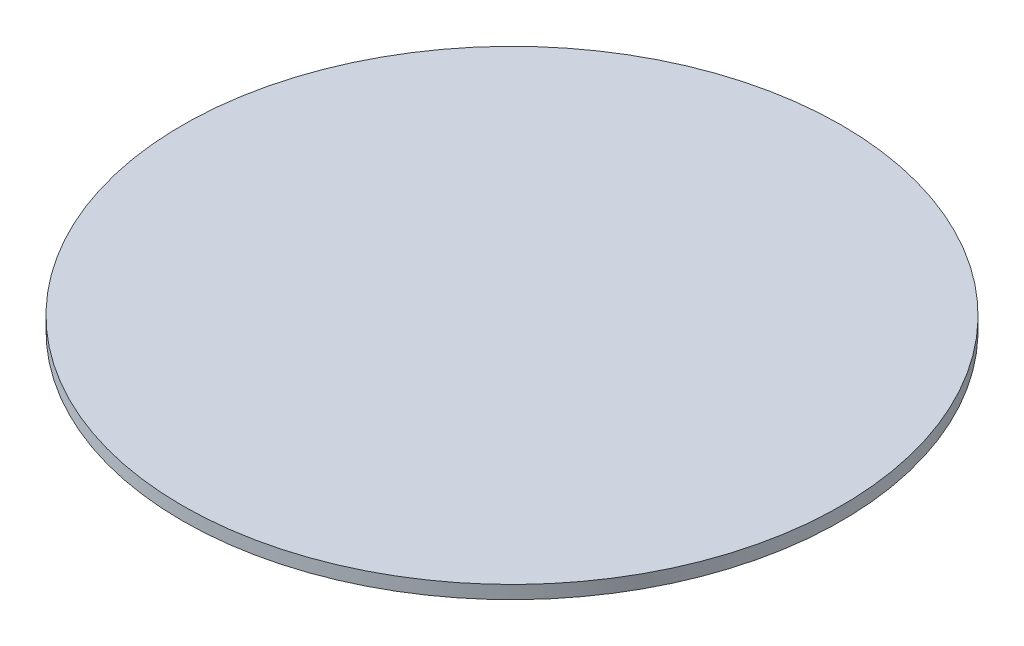
ISO-10303-21;
HEADER;
FILE_DESCRIPTION(('STEP AP214'),'2;1');
FILE_NAME('part.step','',(''),(''),'','','');
FILE_SCHEMA(('AUTOMOTIVE_DESIGN { 1 0 10303 214 1 1 1 1 }'));
ENDSEC;
DATA;
#1=APPLICATION_CONTEXT('core data for automotive mechanical design processes');
#2=APPLICATION_PROTOCOL_DEFINITION('international standard','automotive_design',2000,#1);
#3=PRODUCT_CONTEXT('',#1,'mechanical');
#4=PRODUCT('Part','Part','',(#3));
#5=PRODUCT_RELATED_PRODUCT_CATEGORY('part','',(#4));
#6=PRODUCT_DEFINITION_FORMATION('','',#4);
#7=PRODUCT_DEFINITION_CONTEXT('part definition',#1,'design');
#8=PRODUCT_DEFINITION('design','',#6,#7);
#9=PRODUCT_DEFINITION_SHAPE('','',#8);
#10=(LENGTH_UNIT() NAMED_UNIT(*) SI_UNIT(.MILLI.,.METRE.));
#11=(NAMED_UNIT(*) PLANE_ANGLE_UNIT() SI_UNIT($,.RADIAN.));
#12=(NAMED_UNIT(*) SI_UNIT($,.STERADIAN.) SOLID_ANGLE_UNIT());
#13=UNCERTAINTY_MEASURE_WITH_UNIT(LENGTH_MEASURE(1.E-05),#10,'distance_accuracy_value','');
#14=(GEOMETRIC_REPRESENTATION_CONTEXT(3) GLOBAL_UNCERTAINTY_ASSIGNED_CONTEXT((#13)) GLOBAL_UNIT_ASSIGNED_CONTEXT((#10,
#11,#12)) REPRESENTATION_CONTEXT('',''));
#15=CARTESIAN_POINT('',(0.,0.,0.));
#16=DIRECTION('',(0.,0.,1.));
#17=DIRECTION('',(1.,0.,0.));
#18=AXIS2_PLACEMENT_3D('',#15,#16,#17);
#19=CARTESIAN_POINT('',(0.,3.,0.));
#20=DIRECTION('',(0.,-1.,0.));
#21=DIRECTION('',(0.,0.,-1.));
#22=AXIS2_PLACEMENT_3D('',#19,#20,#21);
#23=CYLINDRICAL_SURFACE('',#22,75.);
#24=CARTESIAN_POINT('',(0.,3.,0.));
#25=DIRECTION('',(0.,1.,0.));
#26=DIRECTION('',(0.,0.,1.));
#27=AXIS2_PLACEMENT_3D('',#24,#25,#26);
#28=CIRCLE('',#27,75.);
#29=CARTESIAN_POINT('',(0.,3.,75.));
#30=VERTEX_POINT('',#29);
#31=EDGE_CURVE('E10',#30,#30,#28,.T.);
#32=ORIENTED_EDGE('',*,*,#31,.F.);
#33=EDGE_LOOP('',(#32));
#34=FACE_BOUND('',#33,.T.);
#35=CARTESIAN_POINT('',(0.,0.,0.));
#36=DIRECTION('',(0.,1.,0.));
#37=DIRECTION('',(0.,0.,1.));
#38=AXIS2_PLACEMENT_3D('',#35,#36,#37);
#39=CIRCLE('',#38,75.);
#40=CARTESIAN_POINT('',(0.,0.,75.));
#41=VERTEX_POINT('',#40);
#42=EDGE_CURVE('E33',#41,#41,#39,.T.);
#43=ORIENTED_EDGE('',*,*,#42,.T.);
#44=EDGE_LOOP('',(#43));
#45=FACE_BOUND('',#44,.T.);
#46=ADVANCED_FACE('F30',(#34,#45),#23,.T.);
#47=CARTESIAN_POINT('',(0.,3.,0.));
#48=DIRECTION('',(0.,1.,0.));
#49=DIRECTION('',(0.,0.,1.));
#50=AXIS2_PLACEMENT_3D('',#47,#48,#49);
#51=PLANE('',#50);
#52=ORIENTED_EDGE('',*,*,#31,.T.);
#53=EDGE_LOOP('',(#52));
#54=FACE_BOUND('',#53,.T.);
#55=ADVANCED_FACE('F45',(#54),#51,.T.);
#56=CARTESIAN_POINT('',(0.,0.,0.));
#57=DIRECTION('',(0.,1.,0.));
#58=DIRECTION('',(0.,0.,1.));
#59=AXIS2_PLACEMENT_3D('',#56,#57,#58);
#60=PLANE('',#59);
#61=ORIENTED_EDGE('',*,*,#42,.F.);
#62=EDGE_LOOP('',(#61));
#63=FACE_BOUND('',#62,.T.);
#64=ADVANCED_FACE('F43',(#63),#60,.F.);
#65=CLOSED_SHELL('',(#46,#55,#64));
#66=MANIFOLD_SOLID_BREP('B2',#65);
#67=ADVANCED_BREP_SHAPE_REPRESENTATION('',(#18,#66),#14);
#68=SHAPE_DEFINITION_REPRESENTATION(#9,#67);
ENDSEC;
END-ISO-10303-21;
